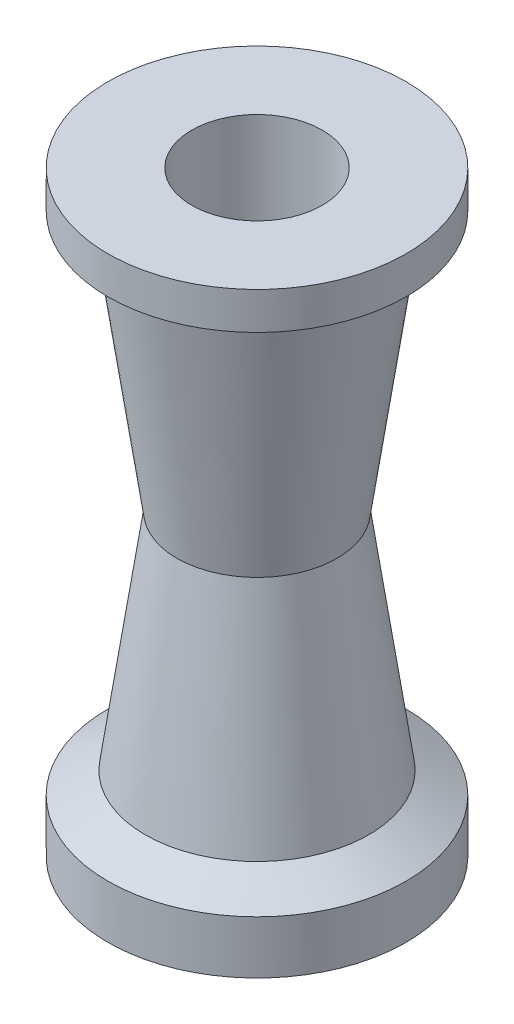
ISO-10303-21;
HEADER;
FILE_DESCRIPTION(('STEP AP214'),'2;1');
FILE_NAME('part.step','',(''),(''),'','','');
FILE_SCHEMA(('AUTOMOTIVE_DESIGN { 1 0 10303 214 1 1 1 1 }'));
ENDSEC;
DATA;
#1=APPLICATION_CONTEXT('core data for automotive mechanical design processes');
#2=APPLICATION_PROTOCOL_DEFINITION('international standard','automotive_design',2000,#1);
#3=PRODUCT_CONTEXT('',#1,'mechanical');
#4=PRODUCT('Part','Part','',(#3));
#5=PRODUCT_RELATED_PRODUCT_CATEGORY('part','',(#4));
#6=PRODUCT_DEFINITION_FORMATION('','',#4);
#7=PRODUCT_DEFINITION_CONTEXT('part definition',#1,'design');
#8=PRODUCT_DEFINITION('design','',#6,#7);
#9=PRODUCT_DEFINITION_SHAPE('','',#8);
#10=(LENGTH_UNIT() NAMED_UNIT(*) SI_UNIT(.MILLI.,.METRE.));
#11=(NAMED_UNIT(*) PLANE_ANGLE_UNIT() SI_UNIT($,.RADIAN.));
#12=(NAMED_UNIT(*) SI_UNIT($,.STERADIAN.) SOLID_ANGLE_UNIT());
#13=UNCERTAINTY_MEASURE_WITH_UNIT(LENGTH_MEASURE(1.E-05),#10,'distance_accuracy_value','');
#14=(GEOMETRIC_REPRESENTATION_CONTEXT(3) GLOBAL_UNCERTAINTY_ASSIGNED_CONTEXT((#13)) GLOBAL_UNIT_ASSIGNED_CONTEXT((#10,
#11,#12)) REPRESENTATION_CONTEXT('',''));
#15=CARTESIAN_POINT('',(0.,0.,0.));
#16=DIRECTION('',(0.,0.,1.));
#17=DIRECTION('',(1.,0.,0.));
#18=AXIS2_PLACEMENT_3D('',#15,#16,#17);
#19=CARTESIAN_POINT('',(4.,8.,0.));
#20=DIRECTION('',(0.,1.,0.));
#21=DIRECTION('',(0.,0.,1.));
#22=AXIS2_PLACEMENT_3D('',#19,#20,#21);
#23=PLANE('',#22);
#24=CARTESIAN_POINT('',(0.,8.,0.));
#25=DIRECTION('',(0.,-1.,0.));
#26=DIRECTION('',(0.,0.,-1.));
#27=AXIS2_PLACEMENT_3D('',#24,#25,#26);
#28=CIRCLE('',#27,1.75);
#29=CARTESIAN_POINT('',(0.,8.,-1.75));
#30=VERTEX_POINT('',#29);
#31=EDGE_CURVE('E50',#30,#30,#28,.T.);
#32=ORIENTED_EDGE('',*,*,#31,.T.);
#33=EDGE_LOOP('',(#32));
#34=FACE_BOUND('',#33,.T.);
#35=CARTESIAN_POINT('',(0.,8.,0.));
#36=DIRECTION('',(0.,-1.,0.));
#37=DIRECTION('',(0.,0.,-1.));
#38=AXIS2_PLACEMENT_3D('',#35,#36,#37);
#39=CIRCLE('',#38,4.);
#40=CARTESIAN_POINT('',(0.,8.,-4.));
#41=VERTEX_POINT('',#40);
#42=EDGE_CURVE('E67',#41,#41,#39,.T.);
#43=ORIENTED_EDGE('',*,*,#42,.F.);
#44=EDGE_LOOP('',(#43));
#45=FACE_BOUND('',#44,.T.);
#46=ADVANCED_FACE('F34',(#34,#45),#23,.T.);
#47=CARTESIAN_POINT('',(0.,0.,0.));
#48=DIRECTION('',(0.,-1.,0.));
#49=DIRECTION('',(0.,0.,-1.));
#50=AXIS2_PLACEMENT_3D('',#47,#48,#49);
#51=CYLINDRICAL_SURFACE('',#50,1.75);
#52=CARTESIAN_POINT('',(0.,-8.,0.));
#53=DIRECTION('',(0.,-1.,0.));
#54=DIRECTION('',(0.,0.,-1.));
#55=AXIS2_PLACEMENT_3D('',#52,#53,#54);
#56=CIRCLE('',#55,1.75);
#57=CARTESIAN_POINT('',(0.,-8.,-1.75));
#58=VERTEX_POINT('',#57);
#59=EDGE_CURVE('E55',#58,#58,#56,.T.);
#60=ORIENTED_EDGE('',*,*,#59,.T.);
#61=EDGE_LOOP('',(#60));
#62=FACE_BOUND('',#61,.T.);
#63=ORIENTED_EDGE('',*,*,#31,.F.);
#64=EDGE_LOOP('',(#63));
#65=FACE_BOUND('',#64,.T.);
#66=ADVANCED_FACE('F74',(#62,#65),#51,.F.);
#67=CARTESIAN_POINT('',(1.75,-8.,0.));
#68=DIRECTION('',(0.,-1.,0.));
#69=DIRECTION('',(0.,0.,-1.));
#70=AXIS2_PLACEMENT_3D('',#67,#68,#69);
#71=PLANE('',#70);
#72=CARTESIAN_POINT('',(0.,-8.,0.));
#73=DIRECTION('',(0.,-1.,0.));
#74=DIRECTION('',(0.,0.,-1.));
#75=AXIS2_PLACEMENT_3D('',#72,#73,#74);
#76=CIRCLE('',#75,4.);
#77=CARTESIAN_POINT('',(0.,-8.,-4.));
#78=VERTEX_POINT('',#77);
#79=EDGE_CURVE('E58',#78,#78,#76,.T.);
#80=ORIENTED_EDGE('',*,*,#79,.T.);
#81=EDGE_LOOP('',(#80));
#82=FACE_BOUND('',#81,.T.);
#83=ORIENTED_EDGE('',*,*,#59,.F.);
#84=EDGE_LOOP('',(#83));
#85=FACE_BOUND('',#84,.T.);
#86=ADVANCED_FACE('F80',(#82,#85),#71,.T.);
#87=CARTESIAN_POINT('',(0.,0.,0.));
#88=DIRECTION('',(0.,-1.,0.));
#89=DIRECTION('',(0.,0.,-1.));
#90=AXIS2_PLACEMENT_3D('',#87,#88,#89);
#91=CYLINDRICAL_SURFACE('',#90,4.);
#92=CARTESIAN_POINT('',(0.,-6.57735026918963,0.));
#93=DIRECTION('',(0.,1.,0.));
#94=DIRECTION('',(0.,0.,1.));
#95=AXIS2_PLACEMENT_3D('',#92,#93,#94);
#96=CIRCLE('',#95,4.);
#97=CARTESIAN_POINT('',(0.,-6.57735026918963,4.));
#98=VERTEX_POINT('',#97);
#99=EDGE_CURVE('E10',#98,#98,#96,.F.);
#100=ORIENTED_EDGE('',*,*,#99,.T.);
#101=EDGE_LOOP('',(#100));
#102=FACE_BOUND('',#101,.T.);
#103=ORIENTED_EDGE('',*,*,#79,.F.);
#104=EDGE_LOOP('',(#103));
#105=FACE_BOUND('',#104,.T.);
#106=ADVANCED_FACE('F108',(#102,#105),#91,.T.);
#107=CARTESIAN_POINT('',(0.,-6.,0.));
#108=DIRECTION('',(0.,-1.,0.));
#109=DIRECTION('',(0.,0.,-1.));
#110=AXIS2_PLACEMENT_3D('',#107,#108,#109);
#111=CONICAL_SURFACE('',#110,3.,0.140730193990225);
#112=CARTESIAN_POINT('',(0.,0.,0.));
#113=DIRECTION('',(0.,-1.,0.));
#114=DIRECTION('',(0.,0.,-1.));
#115=AXIS2_PLACEMENT_3D('',#112,#113,#114);
#116=CIRCLE('',#115,2.15);
#117=CARTESIAN_POINT('',(0.,0.,-2.15));
#118=VERTEX_POINT('',#117);
#119=EDGE_CURVE('E64',#118,#118,#116,.T.);
#120=ORIENTED_EDGE('',*,*,#119,.T.);
#121=EDGE_LOOP('',(#120));
#122=FACE_BOUND('',#121,.T.);
#123=CARTESIAN_POINT('',(0.,-6.,0.));
#124=DIRECTION('',(0.,-1.,0.));
#125=DIRECTION('',(0.,0.,-1.));
#126=AXIS2_PLACEMENT_3D('',#123,#124,#125);
#127=CIRCLE('',#126,3.);
#128=CARTESIAN_POINT('',(0.,-6.,-3.));
#129=VERTEX_POINT('',#128);
#130=EDGE_CURVE('E61',#129,#129,#127,.T.);
#131=ORIENTED_EDGE('',*,*,#130,.F.);
#132=EDGE_LOOP('',(#131));
#133=FACE_BOUND('',#132,.T.);
#134=ADVANCED_FACE('F103',(#122,#133),#111,.T.);
#135=CARTESIAN_POINT('',(0.,0.,0.));
#136=DIRECTION('',(0.,1.,0.));
#137=DIRECTION('',(0.,0.,1.));
#138=AXIS2_PLACEMENT_3D('',#135,#136,#137);
#139=CONICAL_SURFACE('',#138,2.15,0.140730193990225);
#140=CARTESIAN_POINT('',(0.,6.46029810581085,0.));
#141=DIRECTION('',(0.,1.,0.));
#142=DIRECTION('',(0.,0.,1.));
#143=AXIS2_PLACEMENT_3D('',#140,#141,#142);
#144=CIRCLE('',#143,3.0652088983232);
#145=CARTESIAN_POINT('',(0.,6.46029810581085,3.0652088983232));
#146=VERTEX_POINT('',#145);
#147=EDGE_CURVE('E42',#146,#146,#144,.F.);
#148=ORIENTED_EDGE('',*,*,#147,.T.);
#149=EDGE_LOOP('',(#148));
#150=FACE_BOUND('',#149,.T.);
#151=ORIENTED_EDGE('',*,*,#119,.F.);
#152=EDGE_LOOP('',(#151));
#153=FACE_BOUND('',#152,.T.);
#154=ADVANCED_FACE('F95',(#150,#153),#139,.T.);
#155=CARTESIAN_POINT('',(0.,0.,0.));
#156=DIRECTION('',(0.,-1.,0.));
#157=DIRECTION('',(0.,0.,-1.));
#158=AXIS2_PLACEMENT_3D('',#155,#156,#157);
#159=CYLINDRICAL_SURFACE('',#158,4.);
#160=CARTESIAN_POINT('',(0.,7.00000000000001,0.));
#161=DIRECTION('',(0.,-1.,0.));
#162=DIRECTION('',(0.,0.,-1.));
#163=AXIS2_PLACEMENT_3D('',#160,#161,#162);
#164=CIRCLE('',#163,4.);
#165=CARTESIAN_POINT('',(0.,7.00000000000001,-4.));
#166=VERTEX_POINT('',#165);
#167=EDGE_CURVE('E46',#166,#166,#164,.F.);
#168=ORIENTED_EDGE('',*,*,#167,.T.);
#169=EDGE_LOOP('',(#168));
#170=FACE_BOUND('',#169,.T.);
#171=ORIENTED_EDGE('',*,*,#42,.T.);
#172=EDGE_LOOP('',(#171));
#173=FACE_BOUND('',#172,.T.);
#174=ADVANCED_FACE('F71',(#170,#173),#159,.T.);
#175=CARTESIAN_POINT('',(0.,6.,0.));
#176=DIRECTION('',(0.,1.,0.));
#177=DIRECTION('',(0.,0.,1.));
#178=AXIS2_PLACEMENT_3D('',#175,#176,#177);
#179=CONICAL_SURFACE('',#178,2.26794919243108,1.0471975511966);
#180=ORIENTED_EDGE('',*,*,#167,.F.);
#181=EDGE_LOOP('',(#180));
#182=FACE_BOUND('',#181,.T.);
#183=ORIENTED_EDGE('',*,*,#147,.F.);
#184=EDGE_LOOP('',(#183));
#185=FACE_BOUND('',#184,.T.);
#186=ADVANCED_FACE('F85',(#182,#185),#179,.T.);
#187=CARTESIAN_POINT('',(0.,-6.57735026918963,0.));
#188=DIRECTION('',(0.,-1.,0.));
#189=DIRECTION('',(0.,0.,-1.));
#190=AXIS2_PLACEMENT_3D('',#187,#188,#189);
#191=CONICAL_SURFACE('',#190,4.,1.0471975511966);
#192=ORIENTED_EDGE('',*,*,#130,.T.);
#193=EDGE_LOOP('',(#192));
#194=FACE_BOUND('',#193,.T.);
#195=ORIENTED_EDGE('',*,*,#99,.F.);
#196=EDGE_LOOP('',(#195));
#197=FACE_BOUND('',#196,.T.);
#198=ADVANCED_FACE('F37',(#194,#197),#191,.T.);
#199=CLOSED_SHELL('',(#46,#66,#86,#106,#134,#154,#174,#186,#198));
#200=MANIFOLD_SOLID_BREP('B2',#199);
#201=ADVANCED_BREP_SHAPE_REPRESENTATION('',(#18,#200),#14);
#202=SHAPE_DEFINITION_REPRESENTATION(#9,#201);
ENDSEC;
END-ISO-10303-21;
